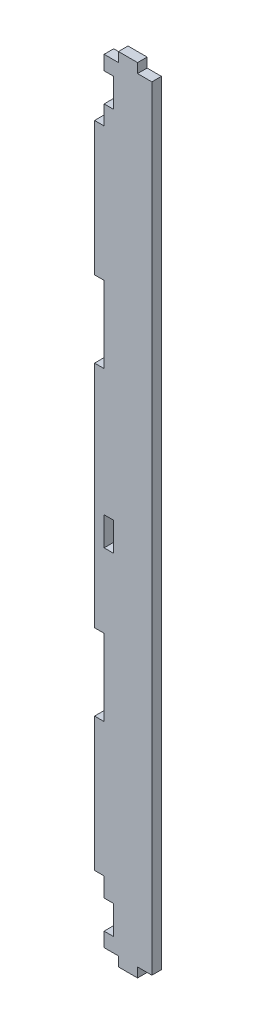
ISO-10303-21;
HEADER;
FILE_DESCRIPTION(('STEP AP214'),'2;1');
FILE_NAME('part.step','',(''),(''),'','','');
FILE_SCHEMA(('AUTOMOTIVE_DESIGN { 1 0 10303 214 1 1 1 1 }'));
ENDSEC;
DATA;
#1=APPLICATION_CONTEXT('core data for automotive mechanical design processes');
#2=APPLICATION_PROTOCOL_DEFINITION('international standard','automotive_design',2000,#1);
#3=PRODUCT_CONTEXT('',#1,'mechanical');
#4=PRODUCT('Part','Part','',(#3));
#5=PRODUCT_RELATED_PRODUCT_CATEGORY('part','',(#4));
#6=PRODUCT_DEFINITION_FORMATION('','',#4);
#7=PRODUCT_DEFINITION_CONTEXT('part definition',#1,'design');
#8=PRODUCT_DEFINITION('design','',#6,#7);
#9=PRODUCT_DEFINITION_SHAPE('','',#8);
#10=(LENGTH_UNIT() NAMED_UNIT(*) SI_UNIT(.MILLI.,.METRE.));
#11=(NAMED_UNIT(*) PLANE_ANGLE_UNIT() SI_UNIT($,.RADIAN.));
#12=(NAMED_UNIT(*) SI_UNIT($,.STERADIAN.) SOLID_ANGLE_UNIT());
#13=UNCERTAINTY_MEASURE_WITH_UNIT(LENGTH_MEASURE(1.E-05),#10,'distance_accuracy_value','');
#14=(GEOMETRIC_REPRESENTATION_CONTEXT(3) GLOBAL_UNCERTAINTY_ASSIGNED_CONTEXT((#13)) GLOBAL_UNIT_ASSIGNED_CONTEXT((#10,
#11,#12)) REPRESENTATION_CONTEXT('',''));
#15=CARTESIAN_POINT('',(0.,0.,0.));
#16=DIRECTION('',(0.,0.,1.));
#17=DIRECTION('',(1.,0.,0.));
#18=AXIS2_PLACEMENT_3D('',#15,#16,#17);
#19=CARTESIAN_POINT('',(-3.15025783237731E-11,-283.750000000054,5.));
#20=DIRECTION('',(1.11022302462615E-13,1.,0.));
#21=DIRECTION('',(-1.,1.11022302462615E-13,0.));
#22=AXIS2_PLACEMENT_3D('',#19,#20,#21);
#23=PLANE('',#22);
#24=DIRECTION('',(1.,-1.11022302462615E-13,0.));
#25=VECTOR('',#24,1.);
#26=CARTESIAN_POINT('',(-3.15025783237731E-11,-283.750000000054,0.));
#27=LINE('',#26,#25);
#28=CARTESIAN_POINT('',(-439.999999999997,-283.750000000005,0.));
#29=VERTEX_POINT('',#28);
#30=CARTESIAN_POINT('',(-435.000000000001,-283.750000000006,0.));
#31=VERTEX_POINT('',#30);
#32=EDGE_CURVE('E386',#29,#31,#27,.T.);
#33=ORIENTED_EDGE('',*,*,#32,.T.);
#34=DIRECTION('',(0.,0.,-1.));
#35=VECTOR('',#34,1.);
#36=CARTESIAN_POINT('',(-435.000000000001,-283.750000000006,5.));
#37=LINE('',#36,#35);
#38=CARTESIAN_POINT('',(-435.000000000001,-283.750000000006,5.));
#39=VERTEX_POINT('',#38);
#40=EDGE_CURVE('E11',#39,#31,#37,.T.);
#41=ORIENTED_EDGE('',*,*,#40,.F.);
#42=DIRECTION('',(1.,-1.11022302462615E-13,0.));
#43=VECTOR('',#42,1.);
#44=CARTESIAN_POINT('',(-3.15025783237731E-11,-283.750000000054,5.));
#45=LINE('',#44,#43);
#46=CARTESIAN_POINT('',(-439.999999999997,-283.750000000005,5.));
#47=VERTEX_POINT('',#46);
#48=EDGE_CURVE('E288',#47,#39,#45,.T.);
#49=ORIENTED_EDGE('',*,*,#48,.F.);
#50=DIRECTION('',(0.,0.,-1.));
#51=VECTOR('',#50,1.);
#52=CARTESIAN_POINT('',(-439.999999999997,-283.750000000005,5.));
#53=LINE('',#52,#51);
#54=EDGE_CURVE('E393',#47,#29,#53,.T.);
#55=ORIENTED_EDGE('',*,*,#54,.T.);
#56=EDGE_LOOP('',(#33,#41,#49,#55));
#57=FACE_BOUND('',#56,.T.);
#58=ADVANCED_FACE('F39',(#57),#23,.F.);
#59=CARTESIAN_POINT('',(-435.000000000083,-1.25566224085134E-10,5.));
#60=DIRECTION('',(1.,2.88657986402552E-13,0.));
#61=DIRECTION('',(-2.88657986402552E-13,1.,0.));
#62=AXIS2_PLACEMENT_3D('',#59,#60,#61);
#63=PLANE('',#62);
#64=DIRECTION('',(2.88657986402552E-13,-1.,0.));
#65=VECTOR('',#64,1.);
#66=CARTESIAN_POINT('',(-435.000000000083,-1.25566224085134E-10,0.));
#67=LINE('',#66,#65);
#68=CARTESIAN_POINT('',(-434.999999999997,-298.750000000005,0.));
#69=VERTEX_POINT('',#68);
#70=EDGE_CURVE('E293',#31,#69,#67,.T.);
#71=ORIENTED_EDGE('',*,*,#70,.T.);
#72=DIRECTION('',(0.,0.,-1.));
#73=VECTOR('',#72,1.);
#74=CARTESIAN_POINT('',(-434.999999999997,-298.750000000005,5.));
#75=LINE('',#74,#73);
#76=CARTESIAN_POINT('',(-434.999999999997,-298.750000000005,5.));
#77=VERTEX_POINT('',#76);
#78=EDGE_CURVE('E49',#77,#69,#75,.T.);
#79=ORIENTED_EDGE('',*,*,#78,.F.);
#80=DIRECTION('',(2.88657986402552E-13,-1.,0.));
#81=VECTOR('',#80,1.);
#82=CARTESIAN_POINT('',(-435.000000000083,-1.25566224085134E-10,5.));
#83=LINE('',#82,#81);
#84=EDGE_CURVE('E282',#39,#77,#83,.T.);
#85=ORIENTED_EDGE('',*,*,#84,.F.);
#86=ORIENTED_EDGE('',*,*,#40,.T.);
#87=EDGE_LOOP('',(#71,#79,#85,#86));
#88=FACE_BOUND('',#87,.T.);
#89=ADVANCED_FACE('F292',(#88),#63,.F.);
#90=CARTESIAN_POINT('',(0.,-298.750000000005,5.));
#91=DIRECTION('',(0.,-1.,0.));
#92=DIRECTION('',(0.,0.,-1.));
#93=AXIS2_PLACEMENT_3D('',#90,#91,#92);
#94=PLANE('',#93);
#95=DIRECTION('',(-1.,0.,0.));
#96=VECTOR('',#95,1.);
#97=CARTESIAN_POINT('',(0.,-298.750000000005,0.));
#98=LINE('',#97,#96);
#99=CARTESIAN_POINT('',(-439.999999999997,-298.750000000005,0.));
#100=VERTEX_POINT('',#99);
#101=EDGE_CURVE('E171',#69,#100,#98,.T.);
#102=ORIENTED_EDGE('',*,*,#101,.T.);
#103=DIRECTION('',(0.,0.,-1.));
#104=VECTOR('',#103,1.);
#105=CARTESIAN_POINT('',(-439.999999999997,-298.750000000005,5.));
#106=LINE('',#105,#104);
#107=CARTESIAN_POINT('',(-439.999999999997,-298.750000000005,5.));
#108=VERTEX_POINT('',#107);
#109=EDGE_CURVE('E294',#108,#100,#106,.T.);
#110=ORIENTED_EDGE('',*,*,#109,.F.);
#111=DIRECTION('',(-1.,0.,0.));
#112=VECTOR('',#111,1.);
#113=CARTESIAN_POINT('',(0.,-298.750000000005,5.));
#114=LINE('',#113,#112);
#115=EDGE_CURVE('E286',#77,#108,#114,.T.);
#116=ORIENTED_EDGE('',*,*,#115,.F.);
#117=ORIENTED_EDGE('',*,*,#78,.T.);
#118=EDGE_LOOP('',(#102,#110,#116,#117));
#119=FACE_BOUND('',#118,.T.);
#120=ADVANCED_FACE('F296',(#119),#94,.F.);
#121=CARTESIAN_POINT('',(-440.,3.25665420557205E-12,5.));
#122=DIRECTION('',(-1.,0.,0.));
#123=DIRECTION('',(0.,-1.,0.));
#124=AXIS2_PLACEMENT_3D('',#121,#122,#123);
#125=PLANE('',#124);
#126=DIRECTION('',(0.,1.,0.));
#127=VECTOR('',#126,1.);
#128=CARTESIAN_POINT('',(-440.,3.25665420557205E-12,0.));
#129=LINE('',#128,#127);
#130=CARTESIAN_POINT('',(-440.000000000001,-82.4999999999887,0.));
#131=VERTEX_POINT('',#130);
#132=CARTESIAN_POINT('',(-440.000000000001,-75.,0.));
#133=VERTEX_POINT('',#132);
#134=EDGE_CURVE('E302',#131,#133,#129,.T.);
#135=ORIENTED_EDGE('',*,*,#134,.F.);
#136=DIRECTION('',(0.,0.,-1.));
#137=VECTOR('',#136,1.);
#138=CARTESIAN_POINT('',(-440.000000000001,-82.4999999999887,5.));
#139=LINE('',#138,#137);
#140=CARTESIAN_POINT('',(-440.000000000001,-82.4999999999887,5.));
#141=VERTEX_POINT('',#140);
#142=EDGE_CURVE('E43',#141,#131,#139,.T.);
#143=ORIENTED_EDGE('',*,*,#142,.F.);
#144=DIRECTION('',(0.,1.,0.));
#145=VECTOR('',#144,1.);
#146=CARTESIAN_POINT('',(-440.,3.25665420557205E-12,5.));
#147=LINE('',#146,#145);
#148=CARTESIAN_POINT('',(-440.000000000001,-75.,5.));
#149=VERTEX_POINT('',#148);
#150=EDGE_CURVE('E392',#141,#149,#147,.T.);
#151=ORIENTED_EDGE('',*,*,#150,.T.);
#152=DIRECTION('',(0.,0.,-1.));
#153=VECTOR('',#152,1.);
#154=CARTESIAN_POINT('',(-440.000000000001,-75.,5.));
#155=LINE('',#154,#153);
#156=EDGE_CURVE('E298',#149,#133,#155,.T.);
#157=ORIENTED_EDGE('',*,*,#156,.T.);
#158=EDGE_LOOP('',(#135,#143,#151,#157));
#159=FACE_BOUND('',#158,.T.);
#160=ADVANCED_FACE('F41',(#159),#125,.T.);
#161=CARTESIAN_POINT('',(0.,-82.4999999999887,5.));
#162=DIRECTION('',(0.,1.,0.));
#163=DIRECTION('',(0.,0.,1.));
#164=AXIS2_PLACEMENT_3D('',#161,#162,#163);
#165=PLANE('',#164);
#166=DIRECTION('',(1.,0.,0.));
#167=VECTOR('',#166,1.);
#168=CARTESIAN_POINT('',(0.,-82.4999999999887,0.));
#169=LINE('',#168,#167);
#170=CARTESIAN_POINT('',(-435.000000000001,-82.4999999999887,0.));
#171=VERTEX_POINT('',#170);
#172=EDGE_CURVE('E305',#131,#171,#169,.T.);
#173=ORIENTED_EDGE('',*,*,#172,.T.);
#174=DIRECTION('',(0.,0.,-1.));
#175=VECTOR('',#174,1.);
#176=CARTESIAN_POINT('',(-435.000000000001,-82.4999999999887,5.));
#177=LINE('',#176,#175);
#178=CARTESIAN_POINT('',(-435.000000000001,-82.4999999999887,5.));
#179=VERTEX_POINT('',#178);
#180=EDGE_CURVE('E465',#179,#171,#177,.T.);
#181=ORIENTED_EDGE('',*,*,#180,.F.);
#182=DIRECTION('',(1.,0.,0.));
#183=VECTOR('',#182,1.);
#184=CARTESIAN_POINT('',(0.,-82.4999999999887,5.));
#185=LINE('',#184,#183);
#186=EDGE_CURVE('E474',#141,#179,#185,.T.);
#187=ORIENTED_EDGE('',*,*,#186,.F.);
#188=ORIENTED_EDGE('',*,*,#142,.T.);
#189=EDGE_LOOP('',(#173,#181,#187,#188));
#190=FACE_BOUND('',#189,.T.);
#191=ADVANCED_FACE('F473',(#190),#165,.F.);
#192=CARTESIAN_POINT('',(-435.000000000001,0.,5.));
#193=DIRECTION('',(1.,0.,0.));
#194=DIRECTION('',(0.,0.,-1.));
#195=AXIS2_PLACEMENT_3D('',#192,#193,#194);
#196=PLANE('',#195);
#197=DIRECTION('',(0.,-1.,0.));
#198=VECTOR('',#197,1.);
#199=CARTESIAN_POINT('',(-435.000000000001,0.,0.));
#200=LINE('',#199,#198);
#201=CARTESIAN_POINT('',(-435.000000000001,-97.4999999999887,0.));
#202=VERTEX_POINT('',#201);
#203=EDGE_CURVE('E307',#171,#202,#200,.T.);
#204=ORIENTED_EDGE('',*,*,#203,.T.);
#205=DIRECTION('',(0.,0.,-1.));
#206=VECTOR('',#205,1.);
#207=CARTESIAN_POINT('',(-435.000000000001,-97.4999999999887,5.));
#208=LINE('',#207,#206);
#209=CARTESIAN_POINT('',(-435.000000000001,-97.4999999999887,5.));
#210=VERTEX_POINT('',#209);
#211=EDGE_CURVE('E463',#210,#202,#208,.T.);
#212=ORIENTED_EDGE('',*,*,#211,.F.);
#213=DIRECTION('',(0.,-1.,0.));
#214=VECTOR('',#213,1.);
#215=CARTESIAN_POINT('',(-435.000000000001,0.,5.));
#216=LINE('',#215,#214);
#217=EDGE_CURVE('E646',#179,#210,#216,.T.);
#218=ORIENTED_EDGE('',*,*,#217,.F.);
#219=ORIENTED_EDGE('',*,*,#180,.T.);
#220=EDGE_LOOP('',(#204,#212,#218,#219));
#221=FACE_BOUND('',#220,.T.);
#222=ADVANCED_FACE('F645',(#221),#196,.F.);
#223=CARTESIAN_POINT('',(0.,-97.4999999999887,5.));
#224=DIRECTION('',(0.,-1.,0.));
#225=DIRECTION('',(0.,0.,-1.));
#226=AXIS2_PLACEMENT_3D('',#223,#224,#225);
#227=PLANE('',#226);
#228=DIRECTION('',(-1.,0.,0.));
#229=VECTOR('',#228,1.);
#230=CARTESIAN_POINT('',(0.,-97.4999999999887,0.));
#231=LINE('',#230,#229);
#232=CARTESIAN_POINT('',(-440.000000000001,-97.4999999999887,0.));
#233=VERTEX_POINT('',#232);
#234=EDGE_CURVE('E309',#202,#233,#231,.T.);
#235=ORIENTED_EDGE('',*,*,#234,.T.);
#236=DIRECTION('',(0.,0.,-1.));
#237=VECTOR('',#236,1.);
#238=CARTESIAN_POINT('',(-440.000000000001,-97.4999999999887,5.));
#239=LINE('',#238,#237);
#240=CARTESIAN_POINT('',(-440.000000000001,-97.4999999999887,5.));
#241=VERTEX_POINT('',#240);
#242=EDGE_CURVE('E461',#241,#233,#239,.T.);
#243=ORIENTED_EDGE('',*,*,#242,.F.);
#244=DIRECTION('',(-1.,0.,0.));
#245=VECTOR('',#244,1.);
#246=CARTESIAN_POINT('',(0.,-97.4999999999887,5.));
#247=LINE('',#246,#245);
#248=EDGE_CURVE('E644',#210,#241,#247,.T.);
#249=ORIENTED_EDGE('',*,*,#248,.F.);
#250=ORIENTED_EDGE('',*,*,#211,.T.);
#251=EDGE_LOOP('',(#235,#243,#249,#250));
#252=FACE_BOUND('',#251,.T.);
#253=ADVANCED_FACE('F642',(#252),#227,.F.);
#254=CARTESIAN_POINT('',(-440.000000000001,-2.44249065417256E-12,5.));
#255=DIRECTION('',(-1.,0.,0.));
#256=DIRECTION('',(0.,-1.,0.));
#257=AXIS2_PLACEMENT_3D('',#254,#255,#256);
#258=PLANE('',#257);
#259=DIRECTION('',(0.,1.,0.));
#260=VECTOR('',#259,1.);
#261=CARTESIAN_POINT('',(-440.000000000001,-2.44249065417256E-12,0.));
#262=LINE('',#261,#260);
#263=CARTESIAN_POINT('',(-440.000000000001,-107.5,0.));
#264=VERTEX_POINT('',#263);
#265=EDGE_CURVE('E312',#264,#233,#262,.T.);
#266=ORIENTED_EDGE('',*,*,#265,.F.);
#267=DIRECTION('',(0.,0.,-1.));
#268=VECTOR('',#267,1.);
#269=CARTESIAN_POINT('',(-440.000000000001,-107.5,5.));
#270=LINE('',#269,#268);
#271=CARTESIAN_POINT('',(-440.000000000001,-107.5,5.));
#272=VERTEX_POINT('',#271);
#273=EDGE_CURVE('E459',#272,#264,#270,.T.);
#274=ORIENTED_EDGE('',*,*,#273,.F.);
#275=DIRECTION('',(0.,1.,0.));
#276=VECTOR('',#275,1.);
#277=CARTESIAN_POINT('',(-440.000000000001,-2.44249065417256E-12,5.));
#278=LINE('',#277,#276);
#279=EDGE_CURVE('E639',#272,#241,#278,.T.);
#280=ORIENTED_EDGE('',*,*,#279,.T.);
#281=ORIENTED_EDGE('',*,*,#242,.T.);
#282=EDGE_LOOP('',(#266,#274,#280,#281));
#283=FACE_BOUND('',#282,.T.);
#284=ADVANCED_FACE('F636',(#283),#258,.T.);
#285=CARTESIAN_POINT('',(0.,-107.5,5.));
#286=DIRECTION('',(0.,-1.,0.));
#287=DIRECTION('',(0.,0.,-1.));
#288=AXIS2_PLACEMENT_3D('',#285,#286,#287);
#289=PLANE('',#288);
#290=DIRECTION('',(-1.,0.,0.));
#291=VECTOR('',#290,1.);
#292=CARTESIAN_POINT('',(0.,-107.5,0.));
#293=LINE('',#292,#291);
#294=CARTESIAN_POINT('',(-445.000000000001,-107.5,0.));
#295=VERTEX_POINT('',#294);
#296=EDGE_CURVE('E315',#264,#295,#293,.T.);
#297=ORIENTED_EDGE('',*,*,#296,.T.);
#298=DIRECTION('',(0.,0.,-1.));
#299=VECTOR('',#298,1.);
#300=CARTESIAN_POINT('',(-445.000000000001,-107.5,5.));
#301=LINE('',#300,#299);
#302=CARTESIAN_POINT('',(-445.000000000001,-107.5,5.));
#303=VERTEX_POINT('',#302);
#304=EDGE_CURVE('E456',#303,#295,#301,.T.);
#305=ORIENTED_EDGE('',*,*,#304,.F.);
#306=DIRECTION('',(-1.,0.,0.));
#307=VECTOR('',#306,1.);
#308=CARTESIAN_POINT('',(0.,-107.5,5.));
#309=LINE('',#308,#307);
#310=EDGE_CURVE('E632',#272,#303,#309,.T.);
#311=ORIENTED_EDGE('',*,*,#310,.F.);
#312=ORIENTED_EDGE('',*,*,#273,.T.);
#313=EDGE_LOOP('',(#297,#305,#311,#312));
#314=FACE_BOUND('',#313,.T.);
#315=ADVANCED_FACE('F631',(#314),#289,.F.);
#316=CARTESIAN_POINT('',(-445.000000000001,0.,5.));
#317=DIRECTION('',(1.,0.,0.));
#318=DIRECTION('',(0.,0.,-1.));
#319=AXIS2_PLACEMENT_3D('',#316,#317,#318);
#320=PLANE('',#319);
#321=DIRECTION('',(0.,-1.,0.));
#322=VECTOR('',#321,1.);
#323=CARTESIAN_POINT('',(-445.000000000001,0.,0.));
#324=LINE('',#323,#322);
#325=CARTESIAN_POINT('',(-445.000000000001,-177.5,0.));
#326=VERTEX_POINT('',#325);
#327=EDGE_CURVE('E317',#295,#326,#324,.T.);
#328=ORIENTED_EDGE('',*,*,#327,.T.);
#329=DIRECTION('',(0.,0.,-1.));
#330=VECTOR('',#329,1.);
#331=CARTESIAN_POINT('',(-445.000000000001,-177.5,5.));
#332=LINE('',#331,#330);
#333=CARTESIAN_POINT('',(-445.000000000001,-177.5,5.));
#334=VERTEX_POINT('',#333);
#335=EDGE_CURVE('E454',#334,#326,#332,.T.);
#336=ORIENTED_EDGE('',*,*,#335,.F.);
#337=DIRECTION('',(0.,-1.,0.));
#338=VECTOR('',#337,1.);
#339=CARTESIAN_POINT('',(-445.000000000001,0.,5.));
#340=LINE('',#339,#338);
#341=EDGE_CURVE('E628',#303,#334,#340,.T.);
#342=ORIENTED_EDGE('',*,*,#341,.F.);
#343=ORIENTED_EDGE('',*,*,#304,.T.);
#344=EDGE_LOOP('',(#328,#336,#342,#343));
#345=FACE_BOUND('',#344,.T.);
#346=ADVANCED_FACE('F626',(#345),#320,.F.);
#347=CARTESIAN_POINT('',(0.,-177.5,5.));
#348=DIRECTION('',(0.,-1.,0.));
#349=DIRECTION('',(0.,0.,-1.));
#350=AXIS2_PLACEMENT_3D('',#347,#348,#349);
#351=PLANE('',#350);
#352=DIRECTION('',(-1.,0.,0.));
#353=VECTOR('',#352,1.);
#354=CARTESIAN_POINT('',(0.,-177.5,0.));
#355=LINE('',#354,#353);
#356=CARTESIAN_POINT('',(-440.,-177.5,0.));
#357=VERTEX_POINT('',#356);
#358=EDGE_CURVE('E320',#357,#326,#355,.T.);
#359=ORIENTED_EDGE('',*,*,#358,.F.);
#360=DIRECTION('',(0.,0.,-1.));
#361=VECTOR('',#360,1.);
#362=CARTESIAN_POINT('',(-440.,-177.5,5.));
#363=LINE('',#362,#361);
#364=CARTESIAN_POINT('',(-440.,-177.5,5.));
#365=VERTEX_POINT('',#364);
#366=EDGE_CURVE('E452',#365,#357,#363,.T.);
#367=ORIENTED_EDGE('',*,*,#366,.F.);
#368=DIRECTION('',(-1.,0.,0.));
#369=VECTOR('',#368,1.);
#370=CARTESIAN_POINT('',(0.,-177.5,5.));
#371=LINE('',#370,#369);
#372=EDGE_CURVE('E623',#365,#334,#371,.T.);
#373=ORIENTED_EDGE('',*,*,#372,.T.);
#374=ORIENTED_EDGE('',*,*,#335,.T.);
#375=EDGE_LOOP('',(#359,#367,#373,#374));
#376=FACE_BOUND('',#375,.T.);
#377=ADVANCED_FACE('F619',(#376),#351,.T.);
#378=CARTESIAN_POINT('',(-440.,6.10622663543837E-13,5.));
#379=DIRECTION('',(-1.,0.,0.));
#380=DIRECTION('',(0.,-1.,0.));
#381=AXIS2_PLACEMENT_3D('',#378,#379,#380);
#382=PLANE('',#381);
#383=DIRECTION('',(0.,1.,0.));
#384=VECTOR('',#383,1.);
#385=CARTESIAN_POINT('',(-440.,6.10622663543837E-13,0.));
#386=LINE('',#385,#384);
#387=CARTESIAN_POINT('',(-440.,-217.5,0.));
#388=VERTEX_POINT('',#387);
#389=EDGE_CURVE('E323',#388,#357,#386,.T.);
#390=ORIENTED_EDGE('',*,*,#389,.F.);
#391=DIRECTION('',(0.,0.,-1.));
#392=VECTOR('',#391,1.);
#393=CARTESIAN_POINT('',(-440.,-217.5,5.));
#394=LINE('',#393,#392);
#395=CARTESIAN_POINT('',(-440.,-217.5,5.));
#396=VERTEX_POINT('',#395);
#397=EDGE_CURVE('E450',#396,#388,#394,.T.);
#398=ORIENTED_EDGE('',*,*,#397,.F.);
#399=DIRECTION('',(0.,1.,0.));
#400=VECTOR('',#399,1.);
#401=CARTESIAN_POINT('',(-440.,6.10622663543837E-13,5.));
#402=LINE('',#401,#400);
#403=EDGE_CURVE('E614',#396,#365,#402,.T.);
#404=ORIENTED_EDGE('',*,*,#403,.T.);
#405=ORIENTED_EDGE('',*,*,#366,.T.);
#406=EDGE_LOOP('',(#390,#398,#404,#405));
#407=FACE_BOUND('',#406,.T.);
#408=ADVANCED_FACE('F613',(#407),#382,.T.);
#409=CARTESIAN_POINT('',(0.,-217.5,5.));
#410=DIRECTION('',(0.,-1.,0.));
#411=DIRECTION('',(0.,0.,-1.));
#412=AXIS2_PLACEMENT_3D('',#409,#410,#411);
#413=PLANE('',#412);
#414=DIRECTION('',(-1.,0.,0.));
#415=VECTOR('',#414,1.);
#416=CARTESIAN_POINT('',(0.,-217.5,0.));
#417=LINE('',#416,#415);
#418=CARTESIAN_POINT('',(-445.,-217.5,0.));
#419=VERTEX_POINT('',#418);
#420=EDGE_CURVE('E326',#388,#419,#417,.T.);
#421=ORIENTED_EDGE('',*,*,#420,.T.);
#422=DIRECTION('',(0.,0.,-1.));
#423=VECTOR('',#422,1.);
#424=CARTESIAN_POINT('',(-445.,-217.5,5.));
#425=LINE('',#424,#423);
#426=CARTESIAN_POINT('',(-445.,-217.5,5.));
#427=VERTEX_POINT('',#426);
#428=EDGE_CURVE('E447',#427,#419,#425,.T.);
#429=ORIENTED_EDGE('',*,*,#428,.F.);
#430=DIRECTION('',(-1.,0.,0.));
#431=VECTOR('',#430,1.);
#432=CARTESIAN_POINT('',(0.,-217.5,5.));
#433=LINE('',#432,#431);
#434=EDGE_CURVE('E609',#396,#427,#433,.T.);
#435=ORIENTED_EDGE('',*,*,#434,.F.);
#436=ORIENTED_EDGE('',*,*,#397,.T.);
#437=EDGE_LOOP('',(#421,#429,#435,#436));
#438=FACE_BOUND('',#437,.T.);
#439=ADVANCED_FACE('F608',(#438),#413,.F.);
#440=CARTESIAN_POINT('',(-445.,0.,5.));
#441=DIRECTION('',(1.,0.,0.));
#442=DIRECTION('',(0.,0.,-1.));
#443=AXIS2_PLACEMENT_3D('',#440,#441,#442);
#444=PLANE('',#443);
#445=DIRECTION('',(0.,-1.,0.));
#446=VECTOR('',#445,1.);
#447=CARTESIAN_POINT('',(-445.,0.,0.));
#448=LINE('',#447,#446);
#449=CARTESIAN_POINT('',(-445.,-337.5,0.));
#450=VERTEX_POINT('',#449);
#451=EDGE_CURVE('E328',#419,#450,#448,.T.);
#452=ORIENTED_EDGE('',*,*,#451,.T.);
#453=DIRECTION('',(0.,0.,-1.));
#454=VECTOR('',#453,1.);
#455=CARTESIAN_POINT('',(-445.,-337.5,5.));
#456=LINE('',#455,#454);
#457=CARTESIAN_POINT('',(-445.,-337.5,5.));
#458=VERTEX_POINT('',#457);
#459=EDGE_CURVE('E445',#458,#450,#456,.T.);
#460=ORIENTED_EDGE('',*,*,#459,.F.);
#461=DIRECTION('',(0.,-1.,0.));
#462=VECTOR('',#461,1.);
#463=CARTESIAN_POINT('',(-445.,0.,5.));
#464=LINE('',#463,#462);
#465=EDGE_CURVE('E605',#427,#458,#464,.T.);
#466=ORIENTED_EDGE('',*,*,#465,.F.);
#467=ORIENTED_EDGE('',*,*,#428,.T.);
#468=EDGE_LOOP('',(#452,#460,#466,#467));
#469=FACE_BOUND('',#468,.T.);
#470=ADVANCED_FACE('F602',(#469),#444,.F.);
#471=CARTESIAN_POINT('',(0.,-337.5,5.));
#472=DIRECTION('',(0.,-1.,0.));
#473=DIRECTION('',(0.,0.,-1.));
#474=AXIS2_PLACEMENT_3D('',#471,#472,#473);
#475=PLANE('',#474);
#476=DIRECTION('',(-1.,0.,0.));
#477=VECTOR('',#476,1.);
#478=CARTESIAN_POINT('',(0.,-337.5,0.));
#479=LINE('',#478,#477);
#480=CARTESIAN_POINT('',(-440.,-337.5,0.));
#481=VERTEX_POINT('',#480);
#482=EDGE_CURVE('E331',#481,#450,#479,.T.);
#483=ORIENTED_EDGE('',*,*,#482,.F.);
#484=DIRECTION('',(0.,0.,-1.));
#485=VECTOR('',#484,1.);
#486=CARTESIAN_POINT('',(-440.,-337.5,5.));
#487=LINE('',#486,#485);
#488=CARTESIAN_POINT('',(-440.,-337.5,5.));
#489=VERTEX_POINT('',#488);
#490=EDGE_CURVE('E443',#489,#481,#487,.T.);
#491=ORIENTED_EDGE('',*,*,#490,.F.);
#492=DIRECTION('',(-1.,0.,0.));
#493=VECTOR('',#492,1.);
#494=CARTESIAN_POINT('',(0.,-337.5,5.));
#495=LINE('',#494,#493);
#496=EDGE_CURVE('E596',#489,#458,#495,.T.);
#497=ORIENTED_EDGE('',*,*,#496,.T.);
#498=ORIENTED_EDGE('',*,*,#459,.T.);
#499=EDGE_LOOP('',(#483,#491,#497,#498));
#500=FACE_BOUND('',#499,.T.);
#501=ADVANCED_FACE('F595',(#500),#475,.T.);
#502=CARTESIAN_POINT('',(-439.999999999999,1.83186799063151E-12,5.));
#503=DIRECTION('',(1.,0.,0.));
#504=DIRECTION('',(0.,1.,0.));
#505=AXIS2_PLACEMENT_3D('',#502,#503,#504);
#506=PLANE('',#505);
#507=DIRECTION('',(0.,-1.,0.));
#508=VECTOR('',#507,1.);
#509=CARTESIAN_POINT('',(-439.999999999999,1.83186799063151E-12,0.));
#510=LINE('',#509,#508);
#511=CARTESIAN_POINT('',(-440.000000000001,-377.5,0.));
#512=VERTEX_POINT('',#511);
#513=EDGE_CURVE('E334',#481,#512,#510,.T.);
#514=ORIENTED_EDGE('',*,*,#513,.T.);
#515=DIRECTION('',(0.,0.,-1.));
#516=VECTOR('',#515,1.);
#517=CARTESIAN_POINT('',(-440.000000000001,-377.5,5.));
#518=LINE('',#517,#516);
#519=CARTESIAN_POINT('',(-440.000000000001,-377.5,5.));
#520=VERTEX_POINT('',#519);
#521=EDGE_CURVE('E440',#520,#512,#518,.T.);
#522=ORIENTED_EDGE('',*,*,#521,.F.);
#523=DIRECTION('',(0.,-1.,0.));
#524=VECTOR('',#523,1.);
#525=CARTESIAN_POINT('',(-439.999999999999,1.83186799063151E-12,5.));
#526=LINE('',#525,#524);
#527=EDGE_CURVE('E591',#489,#520,#526,.T.);
#528=ORIENTED_EDGE('',*,*,#527,.F.);
#529=ORIENTED_EDGE('',*,*,#490,.T.);
#530=EDGE_LOOP('',(#514,#522,#528,#529));
#531=FACE_BOUND('',#530,.T.);
#532=ADVANCED_FACE('F590',(#531),#506,.F.);
#533=CARTESIAN_POINT('',(0.,-377.5,5.));
#534=DIRECTION('',(0.,-1.,0.));
#535=DIRECTION('',(0.,0.,-1.));
#536=AXIS2_PLACEMENT_3D('',#533,#534,#535);
#537=PLANE('',#536);
#538=DIRECTION('',(-1.,0.,0.));
#539=VECTOR('',#538,1.);
#540=CARTESIAN_POINT('',(0.,-377.5,0.));
#541=LINE('',#540,#539);
#542=CARTESIAN_POINT('',(-445.000000000001,-377.5,0.));
#543=VERTEX_POINT('',#542);
#544=EDGE_CURVE('E336',#512,#543,#541,.T.);
#545=ORIENTED_EDGE('',*,*,#544,.T.);
#546=DIRECTION('',(0.,0.,-1.));
#547=VECTOR('',#546,1.);
#548=CARTESIAN_POINT('',(-445.000000000001,-377.5,5.));
#549=LINE('',#548,#547);
#550=CARTESIAN_POINT('',(-445.000000000001,-377.5,5.));
#551=VERTEX_POINT('',#550);
#552=EDGE_CURVE('E438',#551,#543,#549,.T.);
#553=ORIENTED_EDGE('',*,*,#552,.F.);
#554=DIRECTION('',(-1.,0.,0.));
#555=VECTOR('',#554,1.);
#556=CARTESIAN_POINT('',(0.,-377.5,5.));
#557=LINE('',#556,#555);
#558=EDGE_CURVE('E587',#520,#551,#557,.T.);
#559=ORIENTED_EDGE('',*,*,#558,.F.);
#560=ORIENTED_EDGE('',*,*,#521,.T.);
#561=EDGE_LOOP('',(#545,#553,#559,#560));
#562=FACE_BOUND('',#561,.T.);
#563=ADVANCED_FACE('F584',(#562),#537,.F.);
#564=CARTESIAN_POINT('',(-445.000000000001,0.,5.));
#565=DIRECTION('',(-1.,0.,0.));
#566=DIRECTION('',(0.,0.,1.));
#567=AXIS2_PLACEMENT_3D('',#564,#565,#566);
#568=PLANE('',#567);
#569=DIRECTION('',(0.,1.,0.));
#570=VECTOR('',#569,1.);
#571=CARTESIAN_POINT('',(-445.000000000001,0.,0.));
#572=LINE('',#571,#570);
#573=CARTESIAN_POINT('',(-445.000000000001,-447.5,0.));
#574=VERTEX_POINT('',#573);
#575=EDGE_CURVE('E339',#574,#543,#572,.T.);
#576=ORIENTED_EDGE('',*,*,#575,.F.);
#577=DIRECTION('',(0.,0.,-1.));
#578=VECTOR('',#577,1.);
#579=CARTESIAN_POINT('',(-445.000000000001,-447.5,5.));
#580=LINE('',#579,#578);
#581=CARTESIAN_POINT('',(-445.000000000001,-447.5,5.));
#582=VERTEX_POINT('',#581);
#583=EDGE_CURVE('E436',#582,#574,#580,.T.);
#584=ORIENTED_EDGE('',*,*,#583,.F.);
#585=DIRECTION('',(0.,1.,0.));
#586=VECTOR('',#585,1.);
#587=CARTESIAN_POINT('',(-445.000000000001,0.,5.));
#588=LINE('',#587,#586);
#589=EDGE_CURVE('E663',#582,#551,#588,.T.);
#590=ORIENTED_EDGE('',*,*,#589,.T.);
#591=ORIENTED_EDGE('',*,*,#552,.T.);
#592=EDGE_LOOP('',(#576,#584,#590,#591));
#593=FACE_BOUND('',#592,.T.);
#594=ADVANCED_FACE('F578',(#593),#568,.T.);
#595=CARTESIAN_POINT('',(0.,-447.5,5.));
#596=DIRECTION('',(0.,-1.,0.));
#597=DIRECTION('',(0.,0.,-1.));
#598=AXIS2_PLACEMENT_3D('',#595,#596,#597);
#599=PLANE('',#598);
#600=DIRECTION('',(-1.,0.,0.));
#601=VECTOR('',#600,1.);
#602=CARTESIAN_POINT('',(0.,-447.5,0.));
#603=LINE('',#602,#601);
#604=CARTESIAN_POINT('',(-440.000000000001,-447.5,0.));
#605=VERTEX_POINT('',#604);
#606=EDGE_CURVE('E342',#605,#574,#603,.T.);
#607=ORIENTED_EDGE('',*,*,#606,.F.);
#608=DIRECTION('',(0.,0.,-1.));
#609=VECTOR('',#608,1.);
#610=CARTESIAN_POINT('',(-440.000000000001,-447.5,5.));
#611=LINE('',#610,#609);
#612=CARTESIAN_POINT('',(-440.000000000001,-447.5,5.));
#613=VERTEX_POINT('',#612);
#614=EDGE_CURVE('E434',#613,#605,#611,.T.);
#615=ORIENTED_EDGE('',*,*,#614,.F.);
#616=DIRECTION('',(-1.,0.,0.));
#617=VECTOR('',#616,1.);
#618=CARTESIAN_POINT('',(0.,-447.5,5.));
#619=LINE('',#618,#617);
#620=EDGE_CURVE('E574',#613,#582,#619,.T.);
#621=ORIENTED_EDGE('',*,*,#620,.T.);
#622=ORIENTED_EDGE('',*,*,#583,.T.);
#623=EDGE_LOOP('',(#607,#615,#621,#622));
#624=FACE_BOUND('',#623,.T.);
#625=ADVANCED_FACE('F569',(#624),#599,.T.);
#626=CARTESIAN_POINT('',(-440.000000000011,-9.76996261670149E-12,5.));
#627=DIRECTION('',(1.,0.,0.));
#628=DIRECTION('',(0.,1.,0.));
#629=AXIS2_PLACEMENT_3D('',#626,#627,#628);
#630=PLANE('',#629);
#631=DIRECTION('',(0.,-1.,0.));
#632=VECTOR('',#631,1.);
#633=CARTESIAN_POINT('',(-440.000000000011,-9.76996261670149E-12,0.));
#634=LINE('',#633,#632);
#635=CARTESIAN_POINT('',(-440.,-457.5,0.));
#636=VERTEX_POINT('',#635);
#637=EDGE_CURVE('E345',#605,#636,#634,.T.);
#638=ORIENTED_EDGE('',*,*,#637,.T.);
#639=DIRECTION('',(0.,0.,-1.));
#640=VECTOR('',#639,1.);
#641=CARTESIAN_POINT('',(-440.,-457.5,5.));
#642=LINE('',#641,#640);
#643=CARTESIAN_POINT('',(-440.,-457.5,5.));
#644=VERTEX_POINT('',#643);
#645=EDGE_CURVE('E431',#644,#636,#642,.T.);
#646=ORIENTED_EDGE('',*,*,#645,.F.);
#647=DIRECTION('',(0.,-1.,0.));
#648=VECTOR('',#647,1.);
#649=CARTESIAN_POINT('',(-440.000000000011,-9.76996261670149E-12,5.));
#650=LINE('',#649,#648);
#651=EDGE_CURVE('E666',#613,#644,#650,.T.);
#652=ORIENTED_EDGE('',*,*,#651,.F.);
#653=ORIENTED_EDGE('',*,*,#614,.T.);
#654=EDGE_LOOP('',(#638,#646,#652,#653));
#655=FACE_BOUND('',#654,.T.);
#656=ADVANCED_FACE('F867',(#655),#630,.F.);
#657=CARTESIAN_POINT('',(0.,-457.5,5.));
#658=DIRECTION('',(0.,1.,0.));
#659=DIRECTION('',(0.,0.,1.));
#660=AXIS2_PLACEMENT_3D('',#657,#658,#659);
#661=PLANE('',#660);
#662=DIRECTION('',(1.,0.,0.));
#663=VECTOR('',#662,1.);
#664=CARTESIAN_POINT('',(0.,-457.5,0.));
#665=LINE('',#664,#663);
#666=CARTESIAN_POINT('',(-435.,-457.5,0.));
#667=VERTEX_POINT('',#666);
#668=EDGE_CURVE('E347',#636,#667,#665,.T.);
#669=ORIENTED_EDGE('',*,*,#668,.T.);
#670=DIRECTION('',(0.,0.,-1.));
#671=VECTOR('',#670,1.);
#672=CARTESIAN_POINT('',(-435.,-457.5,5.));
#673=LINE('',#672,#671);
#674=CARTESIAN_POINT('',(-435.,-457.5,5.));
#675=VERTEX_POINT('',#674);
#676=EDGE_CURVE('E428',#675,#667,#673,.T.);
#677=ORIENTED_EDGE('',*,*,#676,.F.);
#678=DIRECTION('',(1.,0.,0.));
#679=VECTOR('',#678,1.);
#680=CARTESIAN_POINT('',(0.,-457.5,5.));
#681=LINE('',#680,#679);
#682=EDGE_CURVE('E563',#644,#675,#681,.T.);
#683=ORIENTED_EDGE('',*,*,#682,.F.);
#684=ORIENTED_EDGE('',*,*,#645,.T.);
#685=EDGE_LOOP('',(#669,#677,#683,#684));
#686=FACE_BOUND('',#685,.T.);
#687=ADVANCED_FACE('F562',(#686),#661,.F.);
#688=CARTESIAN_POINT('',(-435.,0.,5.));
#689=DIRECTION('',(1.,0.,0.));
#690=DIRECTION('',(0.,0.,-1.));
#691=AXIS2_PLACEMENT_3D('',#688,#689,#690);
#692=PLANE('',#691);
#693=DIRECTION('',(0.,-1.,0.));
#694=VECTOR('',#693,1.);
#695=CARTESIAN_POINT('',(-435.,0.,0.));
#696=LINE('',#695,#694);
#697=CARTESIAN_POINT('',(-435.,-472.5,0.));
#698=VERTEX_POINT('',#697);
#699=EDGE_CURVE('E349',#667,#698,#696,.T.);
#700=ORIENTED_EDGE('',*,*,#699,.T.);
#701=DIRECTION('',(0.,0.,-1.));
#702=VECTOR('',#701,1.);
#703=CARTESIAN_POINT('',(-435.,-472.5,5.));
#704=LINE('',#703,#702);
#705=CARTESIAN_POINT('',(-435.,-472.5,5.));
#706=VERTEX_POINT('',#705);
#707=EDGE_CURVE('E425',#706,#698,#704,.T.);
#708=ORIENTED_EDGE('',*,*,#707,.F.);
#709=DIRECTION('',(0.,-1.,0.));
#710=VECTOR('',#709,1.);
#711=CARTESIAN_POINT('',(-435.,0.,5.));
#712=LINE('',#711,#710);
#713=EDGE_CURVE('E558',#675,#706,#712,.T.);
#714=ORIENTED_EDGE('',*,*,#713,.F.);
#715=ORIENTED_EDGE('',*,*,#676,.T.);
#716=EDGE_LOOP('',(#700,#708,#714,#715));
#717=FACE_BOUND('',#716,.T.);
#718=ADVANCED_FACE('F557',(#717),#692,.F.);
#719=CARTESIAN_POINT('',(0.,-472.5,5.));
#720=DIRECTION('',(0.,-1.,0.));
#721=DIRECTION('',(0.,0.,-1.));
#722=AXIS2_PLACEMENT_3D('',#719,#720,#721);
#723=PLANE('',#722);
#724=DIRECTION('',(-1.,0.,0.));
#725=VECTOR('',#724,1.);
#726=CARTESIAN_POINT('',(0.,-472.5,0.));
#727=LINE('',#726,#725);
#728=CARTESIAN_POINT('',(-440.,-472.5,0.));
#729=VERTEX_POINT('',#728);
#730=EDGE_CURVE('E351',#698,#729,#727,.T.);
#731=ORIENTED_EDGE('',*,*,#730,.T.);
#732=DIRECTION('',(0.,0.,-1.));
#733=VECTOR('',#732,1.);
#734=CARTESIAN_POINT('',(-440.,-472.5,5.));
#735=LINE('',#734,#733);
#736=CARTESIAN_POINT('',(-440.,-472.5,5.));
#737=VERTEX_POINT('',#736);
#738=EDGE_CURVE('E422',#737,#729,#735,.T.);
#739=ORIENTED_EDGE('',*,*,#738,.F.);
#740=DIRECTION('',(-1.,0.,0.));
#741=VECTOR('',#740,1.);
#742=CARTESIAN_POINT('',(0.,-472.5,5.));
#743=LINE('',#742,#741);
#744=EDGE_CURVE('E554',#706,#737,#743,.T.);
#745=ORIENTED_EDGE('',*,*,#744,.F.);
#746=ORIENTED_EDGE('',*,*,#707,.T.);
#747=EDGE_LOOP('',(#731,#739,#745,#746));
#748=FACE_BOUND('',#747,.T.);
#749=ADVANCED_FACE('F551',(#748),#723,.F.);
#750=CARTESIAN_POINT('',(-439.999999999983,1.62832710278351E-11,5.));
#751=DIRECTION('',(1.,0.,0.));
#752=DIRECTION('',(0.,1.,0.));
#753=AXIS2_PLACEMENT_3D('',#750,#751,#752);
#754=PLANE('',#753);
#755=DIRECTION('',(0.,-1.,0.));
#756=VECTOR('',#755,1.);
#757=CARTESIAN_POINT('',(-439.999999999983,1.62832710278351E-11,0.));
#758=LINE('',#757,#756);
#759=CARTESIAN_POINT('',(-440.000000000001,-480.,0.));
#760=VERTEX_POINT('',#759);
#761=EDGE_CURVE('E353',#729,#760,#758,.T.);
#762=ORIENTED_EDGE('',*,*,#761,.T.);
#763=DIRECTION('',(0.,0.,-1.));
#764=VECTOR('',#763,1.);
#765=CARTESIAN_POINT('',(-440.000000000001,-480.,5.));
#766=LINE('',#765,#764);
#767=CARTESIAN_POINT('',(-440.000000000001,-480.,5.));
#768=VERTEX_POINT('',#767);
#769=EDGE_CURVE('E420',#768,#760,#766,.T.);
#770=ORIENTED_EDGE('',*,*,#769,.F.);
#771=DIRECTION('',(0.,-1.,0.));
#772=VECTOR('',#771,1.);
#773=CARTESIAN_POINT('',(-439.999999999983,1.62832710278351E-11,5.));
#774=LINE('',#773,#772);
#775=EDGE_CURVE('E671',#737,#768,#774,.T.);
#776=ORIENTED_EDGE('',*,*,#775,.F.);
#777=ORIENTED_EDGE('',*,*,#738,.T.);
#778=EDGE_LOOP('',(#762,#770,#776,#777));
#779=FACE_BOUND('',#778,.T.);
#780=ADVANCED_FACE('F545',(#779),#754,.F.);
#781=CARTESIAN_POINT('',(0.,-480.,5.));
#782=DIRECTION('',(0.,-1.,0.));
#783=DIRECTION('',(0.,0.,-1.));
#784=AXIS2_PLACEMENT_3D('',#781,#782,#783);
#785=PLANE('',#784);
#786=DIRECTION('',(-1.,0.,0.));
#787=VECTOR('',#786,1.);
#788=CARTESIAN_POINT('',(0.,-480.,0.));
#789=LINE('',#788,#787);
#790=CARTESIAN_POINT('',(-432.500000000001,-480.,0.));
#791=VERTEX_POINT('',#790);
#792=EDGE_CURVE('E356',#791,#760,#789,.T.);
#793=ORIENTED_EDGE('',*,*,#792,.F.);
#794=DIRECTION('',(0.,0.,-1.));
#795=VECTOR('',#794,1.);
#796=CARTESIAN_POINT('',(-432.500000000001,-480.,5.));
#797=LINE('',#796,#795);
#798=CARTESIAN_POINT('',(-432.500000000001,-480.,5.));
#799=VERTEX_POINT('',#798);
#800=EDGE_CURVE('E418',#799,#791,#797,.T.);
#801=ORIENTED_EDGE('',*,*,#800,.F.);
#802=DIRECTION('',(-1.,0.,0.));
#803=VECTOR('',#802,1.);
#804=CARTESIAN_POINT('',(0.,-480.,5.));
#805=LINE('',#804,#803);
#806=EDGE_CURVE('E542',#799,#768,#805,.T.);
#807=ORIENTED_EDGE('',*,*,#806,.T.);
#808=ORIENTED_EDGE('',*,*,#769,.T.);
#809=EDGE_LOOP('',(#793,#801,#807,#808));
#810=FACE_BOUND('',#809,.T.);
#811=ADVANCED_FACE('F540',(#810),#785,.T.);
#812=CARTESIAN_POINT('',(-432.500000000001,0.,5.));
#813=DIRECTION('',(-1.,0.,0.));
#814=DIRECTION('',(0.,0.,1.));
#815=AXIS2_PLACEMENT_3D('',#812,#813,#814);
#816=PLANE('',#815);
#817=DIRECTION('',(0.,1.,0.));
#818=VECTOR('',#817,1.);
#819=CARTESIAN_POINT('',(-432.500000000001,0.,0.));
#820=LINE('',#819,#818);
#821=CARTESIAN_POINT('',(-432.500000000001,-485.,0.));
#822=VERTEX_POINT('',#821);
#823=EDGE_CURVE('E359',#822,#791,#820,.T.);
#824=ORIENTED_EDGE('',*,*,#823,.F.);
#825=DIRECTION('',(0.,0.,-1.));
#826=VECTOR('',#825,1.);
#827=CARTESIAN_POINT('',(-432.500000000001,-485.,5.));
#828=LINE('',#827,#826);
#829=CARTESIAN_POINT('',(-432.500000000001,-485.,5.));
#830=VERTEX_POINT('',#829);
#831=EDGE_CURVE('E416',#830,#822,#828,.T.);
#832=ORIENTED_EDGE('',*,*,#831,.F.);
#833=DIRECTION('',(0.,1.,0.));
#834=VECTOR('',#833,1.);
#835=CARTESIAN_POINT('',(-432.500000000001,0.,5.));
#836=LINE('',#835,#834);
#837=EDGE_CURVE('E536',#830,#799,#836,.T.);
#838=ORIENTED_EDGE('',*,*,#837,.T.);
#839=ORIENTED_EDGE('',*,*,#800,.T.);
#840=EDGE_LOOP('',(#824,#832,#838,#839));
#841=FACE_BOUND('',#840,.T.);
#842=ADVANCED_FACE('F533',(#841),#816,.T.);
#843=CARTESIAN_POINT('',(0.,-485.,5.));
#844=DIRECTION('',(0.,-1.,0.));
#845=DIRECTION('',(0.,0.,-1.));
#846=AXIS2_PLACEMENT_3D('',#843,#844,#845);
#847=PLANE('',#846);
#848=DIRECTION('',(-1.,0.,0.));
#849=VECTOR('',#848,1.);
#850=CARTESIAN_POINT('',(0.,-485.,0.));
#851=LINE('',#850,#849);
#852=CARTESIAN_POINT('',(-422.500000000001,-485.,0.));
#853=VERTEX_POINT('',#852);
#854=EDGE_CURVE('E362',#853,#822,#851,.T.);
#855=ORIENTED_EDGE('',*,*,#854,.F.);
#856=DIRECTION('',(0.,0.,-1.));
#857=VECTOR('',#856,1.);
#858=CARTESIAN_POINT('',(-422.500000000001,-485.,5.));
#859=LINE('',#858,#857);
#860=CARTESIAN_POINT('',(-422.500000000001,-485.,5.));
#861=VERTEX_POINT('',#860);
#862=EDGE_CURVE('E414',#861,#853,#859,.T.);
#863=ORIENTED_EDGE('',*,*,#862,.F.);
#864=DIRECTION('',(-1.,0.,0.));
#865=VECTOR('',#864,1.);
#866=CARTESIAN_POINT('',(0.,-485.,5.));
#867=LINE('',#866,#865);
#868=EDGE_CURVE('E675',#861,#830,#867,.T.);
#869=ORIENTED_EDGE('',*,*,#868,.T.);
#870=ORIENTED_EDGE('',*,*,#831,.T.);
#871=EDGE_LOOP('',(#855,#863,#869,#870));
#872=FACE_BOUND('',#871,.T.);
#873=ADVANCED_FACE('F528',(#872),#847,.T.);
#874=CARTESIAN_POINT('',(-422.500000000001,0.,5.));
#875=DIRECTION('',(1.,0.,0.));
#876=DIRECTION('',(0.,0.,-1.));
#877=AXIS2_PLACEMENT_3D('',#874,#875,#876);
#878=PLANE('',#877);
#879=DIRECTION('',(0.,-1.,0.));
#880=VECTOR('',#879,1.);
#881=CARTESIAN_POINT('',(-422.500000000001,0.,0.));
#882=LINE('',#881,#880);
#883=CARTESIAN_POINT('',(-422.500000000001,-480.,0.));
#884=VERTEX_POINT('',#883);
#885=EDGE_CURVE('E365',#884,#853,#882,.T.);
#886=ORIENTED_EDGE('',*,*,#885,.F.);
#887=DIRECTION('',(0.,0.,-1.));
#888=VECTOR('',#887,1.);
#889=CARTESIAN_POINT('',(-422.500000000001,-480.,5.));
#890=LINE('',#889,#888);
#891=CARTESIAN_POINT('',(-422.500000000001,-480.,5.));
#892=VERTEX_POINT('',#891);
#893=EDGE_CURVE('E412',#892,#884,#890,.T.);
#894=ORIENTED_EDGE('',*,*,#893,.F.);
#895=DIRECTION('',(0.,-1.,0.));
#896=VECTOR('',#895,1.);
#897=CARTESIAN_POINT('',(-422.500000000001,0.,5.));
#898=LINE('',#897,#896);
#899=EDGE_CURVE('E524',#892,#861,#898,.T.);
#900=ORIENTED_EDGE('',*,*,#899,.T.);
#901=ORIENTED_EDGE('',*,*,#862,.T.);
#902=EDGE_LOOP('',(#886,#894,#900,#901));
#903=FACE_BOUND('',#902,.T.);
#904=ADVANCED_FACE('F519',(#903),#878,.T.);
#905=CARTESIAN_POINT('',(0.,-480.,5.));
#906=DIRECTION('',(0.,1.,0.));
#907=DIRECTION('',(0.,0.,1.));
#908=AXIS2_PLACEMENT_3D('',#905,#906,#907);
#909=PLANE('',#908);
#910=DIRECTION('',(1.,0.,0.));
#911=VECTOR('',#910,1.);
#912=CARTESIAN_POINT('',(0.,-480.,0.));
#913=LINE('',#912,#911);
#914=CARTESIAN_POINT('',(-415.000000000001,-480.,0.));
#915=VERTEX_POINT('',#914);
#916=EDGE_CURVE('E368',#884,#915,#913,.T.);
#917=ORIENTED_EDGE('',*,*,#916,.T.);
#918=DIRECTION('',(0.,0.,-1.));
#919=VECTOR('',#918,1.);
#920=CARTESIAN_POINT('',(-415.000000000001,-480.,5.));
#921=LINE('',#920,#919);
#922=CARTESIAN_POINT('',(-415.000000000001,-480.,5.));
#923=VERTEX_POINT('',#922);
#924=EDGE_CURVE('E410',#923,#915,#921,.T.);
#925=ORIENTED_EDGE('',*,*,#924,.F.);
#926=DIRECTION('',(1.,0.,0.));
#927=VECTOR('',#926,1.);
#928=CARTESIAN_POINT('',(0.,-480.,5.));
#929=LINE('',#928,#927);
#930=EDGE_CURVE('E678',#892,#923,#929,.T.);
#931=ORIENTED_EDGE('',*,*,#930,.F.);
#932=ORIENTED_EDGE('',*,*,#893,.T.);
#933=EDGE_LOOP('',(#917,#925,#931,#932));
#934=FACE_BOUND('',#933,.T.);
#935=ADVANCED_FACE('F687',(#934),#909,.F.);
#936=CARTESIAN_POINT('',(-415.000000000001,0.,5.));
#937=DIRECTION('',(1.,0.,0.));
#938=DIRECTION('',(0.,0.,-1.));
#939=AXIS2_PLACEMENT_3D('',#936,#937,#938);
#940=PLANE('',#939);
#941=DIRECTION('',(0.,-1.,0.));
#942=VECTOR('',#941,1.);
#943=CARTESIAN_POINT('',(-415.000000000001,0.,0.));
#944=LINE('',#943,#942);
#945=CARTESIAN_POINT('',(-415.000000000001,-75.,0.));
#946=VERTEX_POINT('',#945);
#947=EDGE_CURVE('E371',#946,#915,#944,.T.);
#948=ORIENTED_EDGE('',*,*,#947,.F.);
#949=DIRECTION('',(0.,0.,-1.));
#950=VECTOR('',#949,1.);
#951=CARTESIAN_POINT('',(-415.000000000001,-75.,5.));
#952=LINE('',#951,#950);
#953=CARTESIAN_POINT('',(-415.000000000001,-75.,5.));
#954=VERTEX_POINT('',#953);
#955=EDGE_CURVE('E408',#954,#946,#952,.T.);
#956=ORIENTED_EDGE('',*,*,#955,.F.);
#957=DIRECTION('',(0.,-1.,0.));
#958=VECTOR('',#957,1.);
#959=CARTESIAN_POINT('',(-415.000000000001,0.,5.));
#960=LINE('',#959,#958);
#961=EDGE_CURVE('E680',#954,#923,#960,.T.);
#962=ORIENTED_EDGE('',*,*,#961,.T.);
#963=ORIENTED_EDGE('',*,*,#924,.T.);
#964=EDGE_LOOP('',(#948,#956,#962,#963));
#965=FACE_BOUND('',#964,.T.);
#966=ADVANCED_FACE('F513',(#965),#940,.T.);
#967=CARTESIAN_POINT('',(0.,-75.,5.));
#968=DIRECTION('',(0.,1.,0.));
#969=DIRECTION('',(0.,0.,1.));
#970=AXIS2_PLACEMENT_3D('',#967,#968,#969);
#971=PLANE('',#970);
#972=DIRECTION('',(1.,0.,0.));
#973=VECTOR('',#972,1.);
#974=CARTESIAN_POINT('',(0.,-75.,0.));
#975=LINE('',#974,#973);
#976=CARTESIAN_POINT('',(-422.500000000001,-75.,0.));
#977=VERTEX_POINT('',#976);
#978=EDGE_CURVE('E374',#977,#946,#975,.T.);
#979=ORIENTED_EDGE('',*,*,#978,.F.);
#980=DIRECTION('',(0.,0.,-1.));
#981=VECTOR('',#980,1.);
#982=CARTESIAN_POINT('',(-422.500000000001,-75.,5.));
#983=LINE('',#982,#981);
#984=CARTESIAN_POINT('',(-422.500000000001,-75.,5.));
#985=VERTEX_POINT('',#984);
#986=EDGE_CURVE('E406',#985,#977,#983,.T.);
#987=ORIENTED_EDGE('',*,*,#986,.F.);
#988=DIRECTION('',(1.,0.,0.));
#989=VECTOR('',#988,1.);
#990=CARTESIAN_POINT('',(0.,-75.,5.));
#991=LINE('',#990,#989);
#992=EDGE_CURVE('E509',#985,#954,#991,.T.);
#993=ORIENTED_EDGE('',*,*,#992,.T.);
#994=ORIENTED_EDGE('',*,*,#955,.T.);
#995=EDGE_LOOP('',(#979,#987,#993,#994));
#996=FACE_BOUND('',#995,.T.);
#997=ADVANCED_FACE('F506',(#996),#971,.T.);
#998=CARTESIAN_POINT('',(-422.500000000001,0.,5.));
#999=DIRECTION('',(-1.,0.,0.));
#1000=DIRECTION('',(0.,0.,1.));
#1001=AXIS2_PLACEMENT_3D('',#998,#999,#1000);
#1002=PLANE('',#1001);
#1003=DIRECTION('',(0.,1.,0.));
#1004=VECTOR('',#1003,1.);
#1005=CARTESIAN_POINT('',(-422.500000000001,0.,0.));
#1006=LINE('',#1005,#1004);
#1007=CARTESIAN_POINT('',(-422.500000000001,-70.,0.));
#1008=VERTEX_POINT('',#1007);
#1009=EDGE_CURVE('E377',#977,#1008,#1006,.T.);
#1010=ORIENTED_EDGE('',*,*,#1009,.T.);
#1011=DIRECTION('',(0.,0.,-1.));
#1012=VECTOR('',#1011,1.);
#1013=CARTESIAN_POINT('',(-422.500000000001,-70.,5.));
#1014=LINE('',#1013,#1012);
#1015=CARTESIAN_POINT('',(-422.500000000001,-70.,5.));
#1016=VERTEX_POINT('',#1015);
#1017=EDGE_CURVE('E403',#1016,#1008,#1014,.T.);
#1018=ORIENTED_EDGE('',*,*,#1017,.F.);
#1019=DIRECTION('',(0.,1.,0.));
#1020=VECTOR('',#1019,1.);
#1021=CARTESIAN_POINT('',(-422.500000000001,0.,5.));
#1022=LINE('',#1021,#1020);
#1023=EDGE_CURVE('E502',#985,#1016,#1022,.T.);
#1024=ORIENTED_EDGE('',*,*,#1023,.F.);
#1025=ORIENTED_EDGE('',*,*,#986,.T.);
#1026=EDGE_LOOP('',(#1010,#1018,#1024,#1025));
#1027=FACE_BOUND('',#1026,.T.);
#1028=ADVANCED_FACE('F501',(#1027),#1002,.F.);
#1029=CARTESIAN_POINT('',(0.,-70.,5.));
#1030=DIRECTION('',(0.,-1.,0.));
#1031=DIRECTION('',(0.,0.,-1.));
#1032=AXIS2_PLACEMENT_3D('',#1029,#1030,#1031);
#1033=PLANE('',#1032);
#1034=DIRECTION('',(-1.,0.,0.));
#1035=VECTOR('',#1034,1.);
#1036=CARTESIAN_POINT('',(0.,-70.,0.));
#1037=LINE('',#1036,#1035);
#1038=CARTESIAN_POINT('',(-432.500000000001,-70.,0.));
#1039=VERTEX_POINT('',#1038);
#1040=EDGE_CURVE('E379',#1008,#1039,#1037,.T.);
#1041=ORIENTED_EDGE('',*,*,#1040,.T.);
#1042=DIRECTION('',(0.,0.,-1.));
#1043=VECTOR('',#1042,1.);
#1044=CARTESIAN_POINT('',(-432.500000000001,-70.,5.));
#1045=LINE('',#1044,#1043);
#1046=CARTESIAN_POINT('',(-432.500000000001,-70.,5.));
#1047=VERTEX_POINT('',#1046);
#1048=EDGE_CURVE('E400',#1047,#1039,#1045,.T.);
#1049=ORIENTED_EDGE('',*,*,#1048,.F.);
#1050=DIRECTION('',(-1.,0.,0.));
#1051=VECTOR('',#1050,1.);
#1052=CARTESIAN_POINT('',(0.,-70.,5.));
#1053=LINE('',#1052,#1051);
#1054=EDGE_CURVE('E497',#1016,#1047,#1053,.T.);
#1055=ORIENTED_EDGE('',*,*,#1054,.F.);
#1056=ORIENTED_EDGE('',*,*,#1017,.T.);
#1057=EDGE_LOOP('',(#1041,#1049,#1055,#1056));
#1058=FACE_BOUND('',#1057,.T.);
#1059=ADVANCED_FACE('F496',(#1058),#1033,.F.);
#1060=CARTESIAN_POINT('',(-432.500000000001,0.,5.));
#1061=DIRECTION('',(1.,0.,0.));
#1062=DIRECTION('',(0.,0.,-1.));
#1063=AXIS2_PLACEMENT_3D('',#1060,#1061,#1062);
#1064=PLANE('',#1063);
#1065=DIRECTION('',(0.,-1.,0.));
#1066=VECTOR('',#1065,1.);
#1067=CARTESIAN_POINT('',(-432.500000000001,0.,0.));
#1068=LINE('',#1067,#1066);
#1069=CARTESIAN_POINT('',(-432.500000000001,-75.,0.));
#1070=VERTEX_POINT('',#1069);
#1071=EDGE_CURVE('E381',#1039,#1070,#1068,.T.);
#1072=ORIENTED_EDGE('',*,*,#1071,.T.);
#1073=DIRECTION('',(0.,0.,-1.));
#1074=VECTOR('',#1073,1.);
#1075=CARTESIAN_POINT('',(-432.500000000001,-75.,5.));
#1076=LINE('',#1075,#1074);
#1077=CARTESIAN_POINT('',(-432.500000000001,-75.,5.));
#1078=VERTEX_POINT('',#1077);
#1079=EDGE_CURVE('E397',#1078,#1070,#1076,.T.);
#1080=ORIENTED_EDGE('',*,*,#1079,.F.);
#1081=DIRECTION('',(0.,-1.,0.));
#1082=VECTOR('',#1081,1.);
#1083=CARTESIAN_POINT('',(-432.500000000001,0.,5.));
#1084=LINE('',#1083,#1082);
#1085=EDGE_CURVE('E493',#1047,#1078,#1084,.T.);
#1086=ORIENTED_EDGE('',*,*,#1085,.F.);
#1087=ORIENTED_EDGE('',*,*,#1048,.T.);
#1088=EDGE_LOOP('',(#1072,#1080,#1086,#1087));
#1089=FACE_BOUND('',#1088,.T.);
#1090=ADVANCED_FACE('F490',(#1089),#1064,.F.);
#1091=CARTESIAN_POINT('',(0.,-75.,5.));
#1092=DIRECTION('',(0.,-1.,0.));
#1093=DIRECTION('',(0.,0.,-1.));
#1094=AXIS2_PLACEMENT_3D('',#1091,#1092,#1093);
#1095=PLANE('',#1094);
#1096=DIRECTION('',(-1.,0.,0.));
#1097=VECTOR('',#1096,1.);
#1098=CARTESIAN_POINT('',(0.,-75.,0.));
#1099=LINE('',#1098,#1097);
#1100=EDGE_CURVE('E383',#1070,#133,#1099,.T.);
#1101=ORIENTED_EDGE('',*,*,#1100,.T.);
#1102=ORIENTED_EDGE('',*,*,#156,.F.);
#1103=DIRECTION('',(-1.,0.,0.));
#1104=VECTOR('',#1103,1.);
#1105=CARTESIAN_POINT('',(0.,-75.,5.));
#1106=LINE('',#1105,#1104);
#1107=EDGE_CURVE('E686',#1078,#149,#1106,.T.);
#1108=ORIENTED_EDGE('',*,*,#1107,.F.);
#1109=ORIENTED_EDGE('',*,*,#1079,.T.);
#1110=EDGE_LOOP('',(#1101,#1102,#1108,#1109));
#1111=FACE_BOUND('',#1110,.T.);
#1112=ADVANCED_FACE('F484',(#1111),#1095,.F.);
#1113=CARTESIAN_POINT('',(-439.999999999997,0.,5.));
#1114=DIRECTION('',(-1.,0.,0.));
#1115=DIRECTION('',(0.,0.,1.));
#1116=AXIS2_PLACEMENT_3D('',#1113,#1114,#1115);
#1117=PLANE('',#1116);
#1118=DIRECTION('',(0.,1.,0.));
#1119=VECTOR('',#1118,1.);
#1120=CARTESIAN_POINT('',(-439.999999999997,0.,0.));
#1121=LINE('',#1120,#1119);
#1122=EDGE_CURVE('E177',#100,#29,#1121,.T.);
#1123=ORIENTED_EDGE('',*,*,#1122,.T.);
#1124=ORIENTED_EDGE('',*,*,#54,.F.);
#1125=DIRECTION('',(0.,1.,0.));
#1126=VECTOR('',#1125,1.);
#1127=CARTESIAN_POINT('',(-439.999999999997,0.,5.));
#1128=LINE('',#1127,#1126);
#1129=EDGE_CURVE('E58',#108,#47,#1128,.T.);
#1130=ORIENTED_EDGE('',*,*,#1129,.F.);
#1131=ORIENTED_EDGE('',*,*,#109,.T.);
#1132=EDGE_LOOP('',(#1123,#1124,#1130,#1131));
#1133=FACE_BOUND('',#1132,.T.);
#1134=ADVANCED_FACE('F707',(#1133),#1117,.F.);
#1135=CARTESIAN_POINT('',(0.,0.,5.));
#1136=DIRECTION('',(0.,0.,1.));
#1137=DIRECTION('',(1.,0.,0.));
#1138=AXIS2_PLACEMENT_3D('',#1135,#1136,#1137);
#1139=PLANE('',#1138);
#1140=ORIENTED_EDGE('',*,*,#150,.F.);
#1141=ORIENTED_EDGE('',*,*,#186,.T.);
#1142=ORIENTED_EDGE('',*,*,#217,.T.);
#1143=ORIENTED_EDGE('',*,*,#248,.T.);
#1144=ORIENTED_EDGE('',*,*,#279,.F.);
#1145=ORIENTED_EDGE('',*,*,#310,.T.);
#1146=ORIENTED_EDGE('',*,*,#341,.T.);
#1147=ORIENTED_EDGE('',*,*,#372,.F.);
#1148=ORIENTED_EDGE('',*,*,#403,.F.);
#1149=ORIENTED_EDGE('',*,*,#434,.T.);
#1150=ORIENTED_EDGE('',*,*,#465,.T.);
#1151=ORIENTED_EDGE('',*,*,#496,.F.);
#1152=ORIENTED_EDGE('',*,*,#527,.T.);
#1153=ORIENTED_EDGE('',*,*,#558,.T.);
#1154=ORIENTED_EDGE('',*,*,#589,.F.);
#1155=ORIENTED_EDGE('',*,*,#620,.F.);
#1156=ORIENTED_EDGE('',*,*,#651,.T.);
#1157=ORIENTED_EDGE('',*,*,#682,.T.);
#1158=ORIENTED_EDGE('',*,*,#713,.T.);
#1159=ORIENTED_EDGE('',*,*,#744,.T.);
#1160=ORIENTED_EDGE('',*,*,#775,.T.);
#1161=ORIENTED_EDGE('',*,*,#806,.F.);
#1162=ORIENTED_EDGE('',*,*,#837,.F.);
#1163=ORIENTED_EDGE('',*,*,#868,.F.);
#1164=ORIENTED_EDGE('',*,*,#899,.F.);
#1165=ORIENTED_EDGE('',*,*,#930,.T.);
#1166=ORIENTED_EDGE('',*,*,#961,.F.);
#1167=ORIENTED_EDGE('',*,*,#992,.F.);
#1168=ORIENTED_EDGE('',*,*,#1023,.T.);
#1169=ORIENTED_EDGE('',*,*,#1054,.T.);
#1170=ORIENTED_EDGE('',*,*,#1085,.T.);
#1171=ORIENTED_EDGE('',*,*,#1107,.T.);
#1172=EDGE_LOOP('',(#1140,#1141,#1142,#1143,#1144,#1145,#1146,#1147,#1148,#1149,#1150,#1151,
#1152,#1153,#1154,#1155,#1156,#1157,#1158,#1159,#1160,#1161,#1162,#1163,#1164,#1165,#1166,#1167,
#1168,#1169,#1170,#1171));
#1173=FACE_BOUND('',#1172,.T.);
#1174=ORIENTED_EDGE('',*,*,#48,.T.);
#1175=ORIENTED_EDGE('',*,*,#84,.T.);
#1176=ORIENTED_EDGE('',*,*,#115,.T.);
#1177=ORIENTED_EDGE('',*,*,#1129,.T.);
#1178=EDGE_LOOP('',(#1174,#1175,#1176,#1177));
#1179=FACE_BOUND('',#1178,.T.);
#1180=ADVANCED_FACE('F284',(#1173,#1179),#1139,.T.);
#1181=CARTESIAN_POINT('',(0.,0.,0.));
#1182=DIRECTION('',(0.,0.,1.));
#1183=DIRECTION('',(1.,0.,0.));
#1184=AXIS2_PLACEMENT_3D('',#1181,#1182,#1183);
#1185=PLANE('',#1184);
#1186=ORIENTED_EDGE('',*,*,#134,.T.);
#1187=ORIENTED_EDGE('',*,*,#1100,.F.);
#1188=ORIENTED_EDGE('',*,*,#1071,.F.);
#1189=ORIENTED_EDGE('',*,*,#1040,.F.);
#1190=ORIENTED_EDGE('',*,*,#1009,.F.);
#1191=ORIENTED_EDGE('',*,*,#978,.T.);
#1192=ORIENTED_EDGE('',*,*,#947,.T.);
#1193=ORIENTED_EDGE('',*,*,#916,.F.);
#1194=ORIENTED_EDGE('',*,*,#885,.T.);
#1195=ORIENTED_EDGE('',*,*,#854,.T.);
#1196=ORIENTED_EDGE('',*,*,#823,.T.);
#1197=ORIENTED_EDGE('',*,*,#792,.T.);
#1198=ORIENTED_EDGE('',*,*,#761,.F.);
#1199=ORIENTED_EDGE('',*,*,#730,.F.);
#1200=ORIENTED_EDGE('',*,*,#699,.F.);
#1201=ORIENTED_EDGE('',*,*,#668,.F.);
#1202=ORIENTED_EDGE('',*,*,#637,.F.);
#1203=ORIENTED_EDGE('',*,*,#606,.T.);
#1204=ORIENTED_EDGE('',*,*,#575,.T.);
#1205=ORIENTED_EDGE('',*,*,#544,.F.);
#1206=ORIENTED_EDGE('',*,*,#513,.F.);
#1207=ORIENTED_EDGE('',*,*,#482,.T.);
#1208=ORIENTED_EDGE('',*,*,#451,.F.);
#1209=ORIENTED_EDGE('',*,*,#420,.F.);
#1210=ORIENTED_EDGE('',*,*,#389,.T.);
#1211=ORIENTED_EDGE('',*,*,#358,.T.);
#1212=ORIENTED_EDGE('',*,*,#327,.F.);
#1213=ORIENTED_EDGE('',*,*,#296,.F.);
#1214=ORIENTED_EDGE('',*,*,#265,.T.);
#1215=ORIENTED_EDGE('',*,*,#234,.F.);
#1216=ORIENTED_EDGE('',*,*,#203,.F.);
#1217=ORIENTED_EDGE('',*,*,#172,.F.);
#1218=EDGE_LOOP('',(#1186,#1187,#1188,#1189,#1190,#1191,#1192,#1193,#1194,#1195,#1196,#1197,
#1198,#1199,#1200,#1201,#1202,#1203,#1204,#1205,#1206,#1207,#1208,#1209,#1210,#1211,#1212,#1213,
#1214,#1215,#1216,#1217));
#1219=FACE_BOUND('',#1218,.T.);
#1220=ORIENTED_EDGE('',*,*,#32,.F.);
#1221=ORIENTED_EDGE('',*,*,#1122,.F.);
#1222=ORIENTED_EDGE('',*,*,#101,.F.);
#1223=ORIENTED_EDGE('',*,*,#70,.F.);
#1224=EDGE_LOOP('',(#1220,#1221,#1222,#1223));
#1225=FACE_BOUND('',#1224,.T.);
#1226=ADVANCED_FACE('F477',(#1219,#1225),#1185,.F.);
#1227=CLOSED_SHELL('',(#58,#89,#120,#160,#191,#222,#253,#284,#315,#346,#377,#408,#439,#470,#501,
#532,#563,#594,#625,#656,#687,#718,#749,#780,#811,#842,#873,#904,#935,#966,#997,#1028,#1059,
#1090,#1112,#1134,#1180,#1226));
#1228=MANIFOLD_SOLID_BREP('B2',#1227);
#1229=ADVANCED_BREP_SHAPE_REPRESENTATION('',(#18,#1228),#14);
#1230=SHAPE_DEFINITION_REPRESENTATION(#9,#1229);
ENDSEC;
END-ISO-10303-21;
